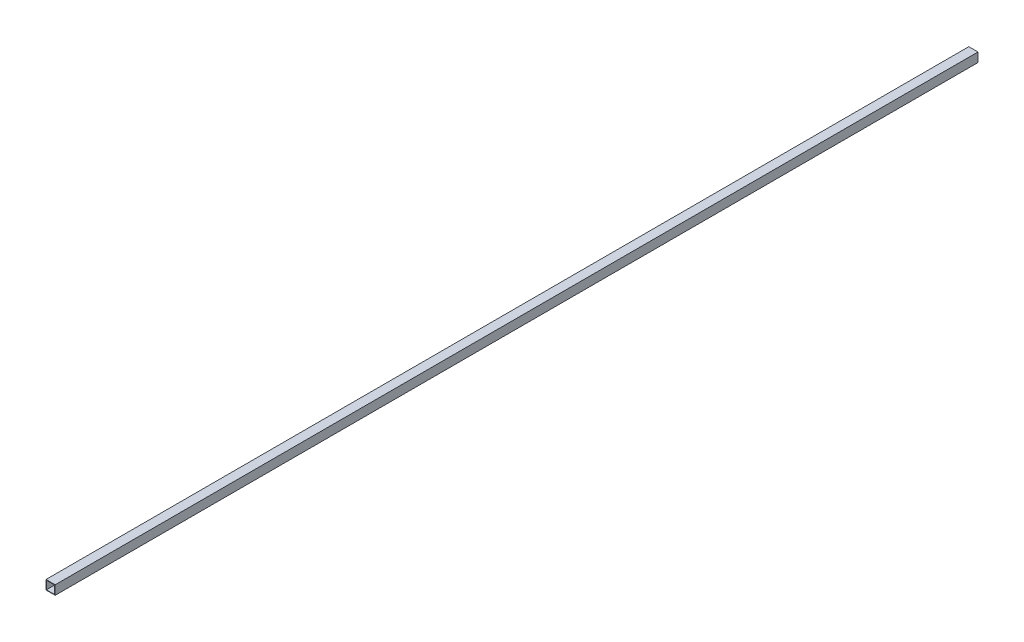
ISO-10303-21;
HEADER;
FILE_DESCRIPTION(('STEP AP214'),'2;1');
FILE_NAME('part.step','',(''),(''),'','','');
FILE_SCHEMA(('AUTOMOTIVE_DESIGN { 1 0 10303 214 1 1 1 1 }'));
ENDSEC;
DATA;
#1=APPLICATION_CONTEXT('core data for automotive mechanical design processes');
#2=APPLICATION_PROTOCOL_DEFINITION('international standard','automotive_design',2000,#1);
#3=PRODUCT_CONTEXT('',#1,'mechanical');
#4=PRODUCT('Part','Part','',(#3));
#5=PRODUCT_RELATED_PRODUCT_CATEGORY('part','',(#4));
#6=PRODUCT_DEFINITION_FORMATION('','',#4);
#7=PRODUCT_DEFINITION_CONTEXT('part definition',#1,'design');
#8=PRODUCT_DEFINITION('design','',#6,#7);
#9=PRODUCT_DEFINITION_SHAPE('','',#8);
#10=(LENGTH_UNIT() NAMED_UNIT(*) SI_UNIT(.MILLI.,.METRE.));
#11=(NAMED_UNIT(*) PLANE_ANGLE_UNIT() SI_UNIT($,.RADIAN.));
#12=(NAMED_UNIT(*) SI_UNIT($,.STERADIAN.) SOLID_ANGLE_UNIT());
#13=UNCERTAINTY_MEASURE_WITH_UNIT(LENGTH_MEASURE(1.E-05),#10,'distance_accuracy_value','');
#14=(GEOMETRIC_REPRESENTATION_CONTEXT(3) GLOBAL_UNCERTAINTY_ASSIGNED_CONTEXT((#13)) GLOBAL_UNIT_ASSIGNED_CONTEXT((#10,
#11,#12)) REPRESENTATION_CONTEXT('',''));
#15=CARTESIAN_POINT('',(0.,0.,0.));
#16=DIRECTION('',(0.,0.,1.));
#17=DIRECTION('',(1.,0.,0.));
#18=AXIS2_PLACEMENT_3D('',#15,#16,#17);
#19=CARTESIAN_POINT('',(-10.,-10.,1005.));
#20=DIRECTION('',(0.,0.,1.));
#21=DIRECTION('',(1.,0.,0.));
#22=AXIS2_PLACEMENT_3D('',#19,#20,#21);
#23=PLANE('',#22);
#24=DIRECTION('',(0.,-1.,0.));
#25=VECTOR('',#24,1.);
#26=CARTESIAN_POINT('',(-10.,-10.,1005.));
#27=LINE('',#26,#25);
#28=CARTESIAN_POINT('',(-10.,9.99999999999999,1005.));
#29=VERTEX_POINT('',#28);
#30=CARTESIAN_POINT('',(-10.,-10.,1005.));
#31=VERTEX_POINT('',#30);
#32=EDGE_CURVE('E156',#29,#31,#27,.T.);
#33=ORIENTED_EDGE('',*,*,#32,.T.);
#34=DIRECTION('',(1.,0.,0.));
#35=VECTOR('',#34,1.);
#36=CARTESIAN_POINT('',(10.,-10.,1005.));
#37=LINE('',#36,#35);
#38=CARTESIAN_POINT('',(10.,-10.,1005.));
#39=VERTEX_POINT('',#38);
#40=EDGE_CURVE('E159',#31,#39,#37,.T.);
#41=ORIENTED_EDGE('',*,*,#40,.T.);
#42=DIRECTION('',(0.,1.,0.));
#43=VECTOR('',#42,1.);
#44=CARTESIAN_POINT('',(10.,-10.,1005.));
#45=LINE('',#44,#43);
#46=CARTESIAN_POINT('',(10.,10.,1005.));
#47=VERTEX_POINT('',#46);
#48=EDGE_CURVE('E162',#39,#47,#45,.T.);
#49=ORIENTED_EDGE('',*,*,#48,.T.);
#50=DIRECTION('',(-1.,0.,0.));
#51=VECTOR('',#50,1.);
#52=CARTESIAN_POINT('',(10.,10.,1005.));
#53=LINE('',#52,#51);
#54=EDGE_CURVE('E164',#47,#29,#53,.T.);
#55=ORIENTED_EDGE('',*,*,#54,.T.);
#56=EDGE_LOOP('',(#33,#41,#49,#55));
#57=FACE_BOUND('',#56,.T.);
#58=DIRECTION('',(1.,0.,0.));
#59=VECTOR('',#58,1.);
#60=CARTESIAN_POINT('',(10.,-9.,1005.));
#61=LINE('',#60,#59);
#62=CARTESIAN_POINT('',(-9.,-9.,1005.));
#63=VERTEX_POINT('',#62);
#64=CARTESIAN_POINT('',(9.,-9.,1005.));
#65=VERTEX_POINT('',#64);
#66=EDGE_CURVE('E128',#63,#65,#61,.T.);
#67=ORIENTED_EDGE('',*,*,#66,.F.);
#68=DIRECTION('',(0.,-1.,0.));
#69=VECTOR('',#68,1.);
#70=CARTESIAN_POINT('',(-9.,-10.,1005.));
#71=LINE('',#70,#69);
#72=CARTESIAN_POINT('',(-9.,9.,1005.));
#73=VERTEX_POINT('',#72);
#74=EDGE_CURVE('E120',#73,#63,#71,.T.);
#75=ORIENTED_EDGE('',*,*,#74,.F.);
#76=DIRECTION('',(-1.,0.,0.));
#77=VECTOR('',#76,1.);
#78=CARTESIAN_POINT('',(10.,9.,1005.));
#79=LINE('',#78,#77);
#80=CARTESIAN_POINT('',(9.,9.,1005.));
#81=VERTEX_POINT('',#80);
#82=EDGE_CURVE('E142',#81,#73,#79,.T.);
#83=ORIENTED_EDGE('',*,*,#82,.F.);
#84=DIRECTION('',(0.,1.,0.));
#85=VECTOR('',#84,1.);
#86=CARTESIAN_POINT('',(9.,-10.,1005.));
#87=LINE('',#86,#85);
#88=EDGE_CURVE('E140',#65,#81,#87,.T.);
#89=ORIENTED_EDGE('',*,*,#88,.F.);
#90=EDGE_LOOP('',(#67,#75,#83,#89));
#91=FACE_BOUND('',#90,.T.);
#92=ADVANCED_FACE('F55',(#57,#91),#23,.T.);
#93=CARTESIAN_POINT('',(-10.,-10.,-1005.));
#94=DIRECTION('',(0.,0.,1.));
#95=DIRECTION('',(1.,0.,0.));
#96=AXIS2_PLACEMENT_3D('',#93,#94,#95);
#97=PLANE('',#96);
#98=DIRECTION('',(0.,-1.,0.));
#99=VECTOR('',#98,1.);
#100=CARTESIAN_POINT('',(-10.,-10.,-1005.));
#101=LINE('',#100,#99);
#102=CARTESIAN_POINT('',(-10.,9.99999999999999,-1005.));
#103=VERTEX_POINT('',#102);
#104=CARTESIAN_POINT('',(-10.,-10.,-1005.));
#105=VERTEX_POINT('',#104);
#106=EDGE_CURVE('E136',#103,#105,#101,.T.);
#107=ORIENTED_EDGE('',*,*,#106,.F.);
#108=DIRECTION('',(-1.,0.,0.));
#109=VECTOR('',#108,1.);
#110=CARTESIAN_POINT('',(10.,10.,-1005.));
#111=LINE('',#110,#109);
#112=CARTESIAN_POINT('',(10.,10.,-1005.));
#113=VERTEX_POINT('',#112);
#114=EDGE_CURVE('E160',#113,#103,#111,.T.);
#115=ORIENTED_EDGE('',*,*,#114,.F.);
#116=DIRECTION('',(0.,1.,0.));
#117=VECTOR('',#116,1.);
#118=CARTESIAN_POINT('',(10.,-10.,-1005.));
#119=LINE('',#118,#117);
#120=CARTESIAN_POINT('',(10.,-10.,-1005.));
#121=VERTEX_POINT('',#120);
#122=EDGE_CURVE('E171',#121,#113,#119,.T.);
#123=ORIENTED_EDGE('',*,*,#122,.F.);
#124=DIRECTION('',(1.,0.,0.));
#125=VECTOR('',#124,1.);
#126=CARTESIAN_POINT('',(10.,-10.,-1005.));
#127=LINE('',#126,#125);
#128=EDGE_CURVE('E169',#105,#121,#127,.T.);
#129=ORIENTED_EDGE('',*,*,#128,.F.);
#130=EDGE_LOOP('',(#107,#115,#123,#129));
#131=FACE_BOUND('',#130,.T.);
#132=DIRECTION('',(0.,-1.,0.));
#133=VECTOR('',#132,1.);
#134=CARTESIAN_POINT('',(-9.,-10.,-1005.));
#135=LINE('',#134,#133);
#136=CARTESIAN_POINT('',(-9.,8.99999999999999,-1005.));
#137=VERTEX_POINT('',#136);
#138=CARTESIAN_POINT('',(-9.,-9.,-1005.));
#139=VERTEX_POINT('',#138);
#140=EDGE_CURVE('E78',#137,#139,#135,.T.);
#141=ORIENTED_EDGE('',*,*,#140,.T.);
#142=DIRECTION('',(1.,0.,0.));
#143=VECTOR('',#142,1.);
#144=CARTESIAN_POINT('',(10.,-9.,-1005.));
#145=LINE('',#144,#143);
#146=CARTESIAN_POINT('',(9.,-9.,-1005.));
#147=VERTEX_POINT('',#146);
#148=EDGE_CURVE('E135',#139,#147,#145,.T.);
#149=ORIENTED_EDGE('',*,*,#148,.T.);
#150=DIRECTION('',(0.,1.,0.));
#151=VECTOR('',#150,1.);
#152=CARTESIAN_POINT('',(9.,-10.,-1005.));
#153=LINE('',#152,#151);
#154=CARTESIAN_POINT('',(9.,9.,-1005.));
#155=VERTEX_POINT('',#154);
#156=EDGE_CURVE('E148',#147,#155,#153,.T.);
#157=ORIENTED_EDGE('',*,*,#156,.T.);
#158=DIRECTION('',(-1.,0.,0.));
#159=VECTOR('',#158,1.);
#160=CARTESIAN_POINT('',(10.,9.,-1005.));
#161=LINE('',#160,#159);
#162=EDGE_CURVE('E129',#155,#137,#161,.T.);
#163=ORIENTED_EDGE('',*,*,#162,.T.);
#164=EDGE_LOOP('',(#141,#149,#157,#163));
#165=FACE_BOUND('',#164,.T.);
#166=ADVANCED_FACE('F189',(#131,#165),#97,.F.);
#167=CARTESIAN_POINT('',(-10.,-10.,1005.));
#168=DIRECTION('',(1.,0.,0.));
#169=DIRECTION('',(0.,0.,-1.));
#170=AXIS2_PLACEMENT_3D('',#167,#168,#169);
#171=PLANE('',#170);
#172=ORIENTED_EDGE('',*,*,#106,.T.);
#173=DIRECTION('',(0.,0.,-1.));
#174=VECTOR('',#173,1.);
#175=CARTESIAN_POINT('',(-10.,-10.,1005.));
#176=LINE('',#175,#174);
#177=EDGE_CURVE('E12',#31,#105,#176,.T.);
#178=ORIENTED_EDGE('',*,*,#177,.F.);
#179=ORIENTED_EDGE('',*,*,#32,.F.);
#180=DIRECTION('',(0.,0.,-1.));
#181=VECTOR('',#180,1.);
#182=CARTESIAN_POINT('',(-10.,9.99999999999999,1005.));
#183=LINE('',#182,#181);
#184=EDGE_CURVE('E166',#29,#103,#183,.T.);
#185=ORIENTED_EDGE('',*,*,#184,.T.);
#186=EDGE_LOOP('',(#172,#178,#179,#185));
#187=FACE_BOUND('',#186,.T.);
#188=ADVANCED_FACE('F57',(#187),#171,.F.);
#189=CARTESIAN_POINT('',(10.,-10.,1005.));
#190=DIRECTION('',(0.,1.,0.));
#191=DIRECTION('',(-1.,0.,0.));
#192=AXIS2_PLACEMENT_3D('',#189,#190,#191);
#193=PLANE('',#192);
#194=ORIENTED_EDGE('',*,*,#128,.T.);
#195=DIRECTION('',(0.,0.,-1.));
#196=VECTOR('',#195,1.);
#197=CARTESIAN_POINT('',(10.,-10.,1005.));
#198=LINE('',#197,#196);
#199=EDGE_CURVE('E63',#39,#121,#198,.T.);
#200=ORIENTED_EDGE('',*,*,#199,.F.);
#201=ORIENTED_EDGE('',*,*,#40,.F.);
#202=ORIENTED_EDGE('',*,*,#177,.T.);
#203=EDGE_LOOP('',(#194,#200,#201,#202));
#204=FACE_BOUND('',#203,.T.);
#205=ADVANCED_FACE('F199',(#204),#193,.F.);
#206=CARTESIAN_POINT('',(10.,-10.,1005.));
#207=DIRECTION('',(-1.,0.,0.));
#208=DIRECTION('',(0.,-1.,0.));
#209=AXIS2_PLACEMENT_3D('',#206,#207,#208);
#210=PLANE('',#209);
#211=ORIENTED_EDGE('',*,*,#122,.T.);
#212=DIRECTION('',(0.,0.,-1.));
#213=VECTOR('',#212,1.);
#214=CARTESIAN_POINT('',(10.,10.,1005.));
#215=LINE('',#214,#213);
#216=EDGE_CURVE('E176',#47,#113,#215,.T.);
#217=ORIENTED_EDGE('',*,*,#216,.F.);
#218=ORIENTED_EDGE('',*,*,#48,.F.);
#219=ORIENTED_EDGE('',*,*,#199,.T.);
#220=EDGE_LOOP('',(#211,#217,#218,#219));
#221=FACE_BOUND('',#220,.T.);
#222=ADVANCED_FACE('F183',(#221),#210,.F.);
#223=CARTESIAN_POINT('',(10.,10.,1005.));
#224=DIRECTION('',(0.,-1.,0.));
#225=DIRECTION('',(1.,0.,0.));
#226=AXIS2_PLACEMENT_3D('',#223,#224,#225);
#227=PLANE('',#226);
#228=ORIENTED_EDGE('',*,*,#114,.T.);
#229=ORIENTED_EDGE('',*,*,#184,.F.);
#230=ORIENTED_EDGE('',*,*,#54,.F.);
#231=ORIENTED_EDGE('',*,*,#216,.T.);
#232=EDGE_LOOP('',(#228,#229,#230,#231));
#233=FACE_BOUND('',#232,.T.);
#234=ADVANCED_FACE('F193',(#233),#227,.F.);
#235=CARTESIAN_POINT('',(-9.,-10.,1005.));
#236=DIRECTION('',(1.,0.,0.));
#237=DIRECTION('',(0.,0.,-1.));
#238=AXIS2_PLACEMENT_3D('',#235,#236,#237);
#239=PLANE('',#238);
#240=ORIENTED_EDGE('',*,*,#140,.F.);
#241=DIRECTION('',(0.,0.,-1.));
#242=VECTOR('',#241,1.);
#243=CARTESIAN_POINT('',(-9.,9.,1005.));
#244=LINE('',#243,#242);
#245=EDGE_CURVE('E124',#73,#137,#244,.T.);
#246=ORIENTED_EDGE('',*,*,#245,.F.);
#247=ORIENTED_EDGE('',*,*,#74,.T.);
#248=DIRECTION('',(0.,0.,-1.));
#249=VECTOR('',#248,1.);
#250=CARTESIAN_POINT('',(-9.,-9.,1005.));
#251=LINE('',#250,#249);
#252=EDGE_CURVE('E123',#63,#139,#251,.T.);
#253=ORIENTED_EDGE('',*,*,#252,.T.);
#254=EDGE_LOOP('',(#240,#246,#247,#253));
#255=FACE_BOUND('',#254,.T.);
#256=ADVANCED_FACE('F122',(#255),#239,.T.);
#257=CARTESIAN_POINT('',(10.,-9.,1005.));
#258=DIRECTION('',(0.,1.,0.));
#259=DIRECTION('',(-1.,0.,0.));
#260=AXIS2_PLACEMENT_3D('',#257,#258,#259);
#261=PLANE('',#260);
#262=ORIENTED_EDGE('',*,*,#148,.F.);
#263=ORIENTED_EDGE('',*,*,#252,.F.);
#264=ORIENTED_EDGE('',*,*,#66,.T.);
#265=DIRECTION('',(0.,0.,-1.));
#266=VECTOR('',#265,1.);
#267=CARTESIAN_POINT('',(9.,-9.,1005.));
#268=LINE('',#267,#266);
#269=EDGE_CURVE('E137',#65,#147,#268,.T.);
#270=ORIENTED_EDGE('',*,*,#269,.T.);
#271=EDGE_LOOP('',(#262,#263,#264,#270));
#272=FACE_BOUND('',#271,.T.);
#273=ADVANCED_FACE('F132',(#272),#261,.T.);
#274=CARTESIAN_POINT('',(9.,-10.,1005.));
#275=DIRECTION('',(-1.,0.,0.));
#276=DIRECTION('',(0.,-1.,0.));
#277=AXIS2_PLACEMENT_3D('',#274,#275,#276);
#278=PLANE('',#277);
#279=ORIENTED_EDGE('',*,*,#156,.F.);
#280=ORIENTED_EDGE('',*,*,#269,.F.);
#281=ORIENTED_EDGE('',*,*,#88,.T.);
#282=DIRECTION('',(0.,0.,-1.));
#283=VECTOR('',#282,1.);
#284=CARTESIAN_POINT('',(9.,9.,1005.));
#285=LINE('',#284,#283);
#286=EDGE_CURVE('E70',#81,#155,#285,.T.);
#287=ORIENTED_EDGE('',*,*,#286,.T.);
#288=EDGE_LOOP('',(#279,#280,#281,#287));
#289=FACE_BOUND('',#288,.T.);
#290=ADVANCED_FACE('F222',(#289),#278,.T.);
#291=CARTESIAN_POINT('',(10.,9.,1005.));
#292=DIRECTION('',(0.,-1.,0.));
#293=DIRECTION('',(1.,0.,0.));
#294=AXIS2_PLACEMENT_3D('',#291,#292,#293);
#295=PLANE('',#294);
#296=ORIENTED_EDGE('',*,*,#162,.F.);
#297=ORIENTED_EDGE('',*,*,#286,.F.);
#298=ORIENTED_EDGE('',*,*,#82,.T.);
#299=ORIENTED_EDGE('',*,*,#245,.T.);
#300=EDGE_LOOP('',(#296,#297,#298,#299));
#301=FACE_BOUND('',#300,.T.);
#302=ADVANCED_FACE('F226',(#301),#295,.T.);
#303=CLOSED_SHELL('',(#92,#166,#188,#205,#222,#234,#256,#273,#290,#302));
#304=MANIFOLD_SOLID_BREP('B2',#303);
#305=ADVANCED_BREP_SHAPE_REPRESENTATION('',(#18,#304),#14);
#306=SHAPE_DEFINITION_REPRESENTATION(#9,#305);
ENDSEC;
END-ISO-10303-21;
